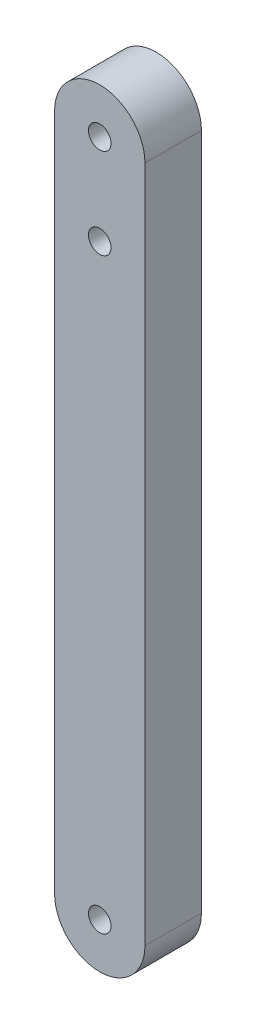
ISO-10303-21;
HEADER;
FILE_DESCRIPTION(('STEP AP214'),'2;1');
FILE_NAME('part.step','',(''),(''),'','','');
FILE_SCHEMA(('AUTOMOTIVE_DESIGN { 1 0 10303 214 1 1 1 1 }'));
ENDSEC;
DATA;
#1=APPLICATION_CONTEXT('core data for automotive mechanical design processes');
#2=APPLICATION_PROTOCOL_DEFINITION('international standard','automotive_design',2000,#1);
#3=PRODUCT_CONTEXT('',#1,'mechanical');
#4=PRODUCT('Part','Part','',(#3));
#5=PRODUCT_RELATED_PRODUCT_CATEGORY('part','',(#4));
#6=PRODUCT_DEFINITION_FORMATION('','',#4);
#7=PRODUCT_DEFINITION_CONTEXT('part definition',#1,'design');
#8=PRODUCT_DEFINITION('design','',#6,#7);
#9=PRODUCT_DEFINITION_SHAPE('','',#8);
#10=(LENGTH_UNIT() NAMED_UNIT(*) SI_UNIT(.MILLI.,.METRE.));
#11=(NAMED_UNIT(*) PLANE_ANGLE_UNIT() SI_UNIT($,.RADIAN.));
#12=(NAMED_UNIT(*) SI_UNIT($,.STERADIAN.) SOLID_ANGLE_UNIT());
#13=UNCERTAINTY_MEASURE_WITH_UNIT(LENGTH_MEASURE(1.E-05),#10,'distance_accuracy_value','');
#14=(GEOMETRIC_REPRESENTATION_CONTEXT(3) GLOBAL_UNCERTAINTY_ASSIGNED_CONTEXT((#13)) GLOBAL_UNIT_ASSIGNED_CONTEXT((#10,
#11,#12)) REPRESENTATION_CONTEXT('',''));
#15=CARTESIAN_POINT('',(0.,0.,0.));
#16=DIRECTION('',(0.,0.,1.));
#17=DIRECTION('',(1.,0.,0.));
#18=AXIS2_PLACEMENT_3D('',#15,#16,#17);
#19=CARTESIAN_POINT('',(0.,0.,10.));
#20=DIRECTION('',(0.,0.,1.));
#21=DIRECTION('',(1.,0.,0.));
#22=AXIS2_PLACEMENT_3D('',#19,#20,#21);
#23=PLANE('',#22);
#24=CARTESIAN_POINT('',(0.,0.,10.));
#25=DIRECTION('',(0.,0.,1.));
#26=DIRECTION('',(1.,0.,0.));
#27=AXIS2_PLACEMENT_3D('',#24,#25,#26);
#28=CIRCLE('',#27,2.);
#29=CARTESIAN_POINT('',(2.,0.,10.));
#30=VERTEX_POINT('',#29);
#31=EDGE_CURVE('E120',#30,#30,#28,.T.);
#32=ORIENTED_EDGE('',*,*,#31,.F.);
#33=EDGE_LOOP('',(#32));
#34=FACE_BOUND('',#33,.T.);
#35=CARTESIAN_POINT('',(0.,0.,10.));
#36=DIRECTION('',(0.,0.,1.));
#37=DIRECTION('',(1.,0.,0.));
#38=AXIS2_PLACEMENT_3D('',#35,#36,#37);
#39=CIRCLE('',#38,8.);
#40=CARTESIAN_POINT('',(-8.,0.,10.));
#41=VERTEX_POINT('',#40);
#42=CARTESIAN_POINT('',(8.,0.,10.));
#43=VERTEX_POINT('',#42);
#44=EDGE_CURVE('E90',#41,#43,#39,.T.);
#45=ORIENTED_EDGE('',*,*,#44,.T.);
#46=DIRECTION('',(0.,1.,0.));
#47=VECTOR('',#46,1.);
#48=CARTESIAN_POINT('',(8.,0.,10.));
#49=LINE('',#48,#47);
#50=CARTESIAN_POINT('',(8.,120.,10.));
#51=VERTEX_POINT('',#50);
#52=EDGE_CURVE('E85',#43,#51,#49,.T.);
#53=ORIENTED_EDGE('',*,*,#52,.T.);
#54=CARTESIAN_POINT('',(0.,120.,10.));
#55=DIRECTION('',(0.,0.,1.));
#56=DIRECTION('',(1.,0.,0.));
#57=AXIS2_PLACEMENT_3D('',#54,#55,#56);
#58=CIRCLE('',#57,8.);
#59=CARTESIAN_POINT('',(-8.,120.,10.));
#60=VERTEX_POINT('',#59);
#61=EDGE_CURVE('E88',#51,#60,#58,.T.);
#62=ORIENTED_EDGE('',*,*,#61,.T.);
#63=DIRECTION('',(0.,-1.,0.));
#64=VECTOR('',#63,1.);
#65=CARTESIAN_POINT('',(-8.,0.,10.));
#66=LINE('',#65,#64);
#67=EDGE_CURVE('E55',#60,#41,#66,.T.);
#68=ORIENTED_EDGE('',*,*,#67,.T.);
#69=EDGE_LOOP('',(#45,#53,#62,#68));
#70=FACE_BOUND('',#69,.T.);
#71=CARTESIAN_POINT('',(0.,120.,10.));
#72=DIRECTION('',(0.,0.,1.));
#73=DIRECTION('',(1.,0.,0.));
#74=AXIS2_PLACEMENT_3D('',#71,#72,#73);
#75=CIRCLE('',#74,2.);
#76=CARTESIAN_POINT('',(2.,120.,10.));
#77=VERTEX_POINT('',#76);
#78=EDGE_CURVE('E105',#77,#77,#75,.T.);
#79=ORIENTED_EDGE('',*,*,#78,.F.);
#80=EDGE_LOOP('',(#79));
#81=FACE_BOUND('',#80,.T.);
#82=CARTESIAN_POINT('',(0.,104.,10.));
#83=DIRECTION('',(0.,0.,1.));
#84=DIRECTION('',(1.,0.,0.));
#85=AXIS2_PLACEMENT_3D('',#82,#83,#84);
#86=CIRCLE('',#85,2.);
#87=CARTESIAN_POINT('',(2.,104.,10.));
#88=VERTEX_POINT('',#87);
#89=EDGE_CURVE('E126',#88,#88,#86,.T.);
#90=ORIENTED_EDGE('',*,*,#89,.F.);
#91=EDGE_LOOP('',(#90));
#92=FACE_BOUND('',#91,.T.);
#93=ADVANCED_FACE('F38',(#34,#70,#81,#92),#23,.T.);
#94=CARTESIAN_POINT('',(0.,0.,0.));
#95=DIRECTION('',(0.,0.,1.));
#96=DIRECTION('',(1.,0.,0.));
#97=AXIS2_PLACEMENT_3D('',#94,#95,#96);
#98=PLANE('',#97);
#99=CARTESIAN_POINT('',(0.,0.,0.));
#100=DIRECTION('',(0.,0.,1.));
#101=DIRECTION('',(1.,0.,0.));
#102=AXIS2_PLACEMENT_3D('',#99,#100,#101);
#103=CIRCLE('',#102,8.);
#104=CARTESIAN_POINT('',(-8.,0.,0.));
#105=VERTEX_POINT('',#104);
#106=CARTESIAN_POINT('',(8.,0.,0.));
#107=VERTEX_POINT('',#106);
#108=EDGE_CURVE('E102',#105,#107,#103,.T.);
#109=ORIENTED_EDGE('',*,*,#108,.F.);
#110=DIRECTION('',(0.,-1.,0.));
#111=VECTOR('',#110,1.);
#112=CARTESIAN_POINT('',(-8.,0.,0.));
#113=LINE('',#112,#111);
#114=CARTESIAN_POINT('',(-8.,120.,0.));
#115=VERTEX_POINT('',#114);
#116=EDGE_CURVE('E78',#115,#105,#113,.T.);
#117=ORIENTED_EDGE('',*,*,#116,.F.);
#118=CARTESIAN_POINT('',(0.,120.,0.));
#119=DIRECTION('',(0.,0.,1.));
#120=DIRECTION('',(1.,0.,0.));
#121=AXIS2_PLACEMENT_3D('',#118,#119,#120);
#122=CIRCLE('',#121,8.);
#123=CARTESIAN_POINT('',(8.,120.,0.));
#124=VERTEX_POINT('',#123);
#125=EDGE_CURVE('E72',#124,#115,#122,.T.);
#126=ORIENTED_EDGE('',*,*,#125,.F.);
#127=DIRECTION('',(0.,1.,0.));
#128=VECTOR('',#127,1.);
#129=CARTESIAN_POINT('',(8.,0.,0.));
#130=LINE('',#129,#128);
#131=EDGE_CURVE('E94',#107,#124,#130,.T.);
#132=ORIENTED_EDGE('',*,*,#131,.F.);
#133=EDGE_LOOP('',(#109,#117,#126,#132));
#134=FACE_BOUND('',#133,.T.);
#135=CARTESIAN_POINT('',(0.,120.,0.));
#136=DIRECTION('',(0.,0.,1.));
#137=DIRECTION('',(1.,0.,0.));
#138=AXIS2_PLACEMENT_3D('',#135,#136,#137);
#139=CIRCLE('',#138,2.);
#140=CARTESIAN_POINT('',(2.,120.,0.));
#141=VERTEX_POINT('',#140);
#142=EDGE_CURVE('E117',#141,#141,#139,.T.);
#143=ORIENTED_EDGE('',*,*,#142,.T.);
#144=EDGE_LOOP('',(#143));
#145=FACE_BOUND('',#144,.T.);
#146=CARTESIAN_POINT('',(0.,0.,0.));
#147=DIRECTION('',(0.,0.,1.));
#148=DIRECTION('',(1.,0.,0.));
#149=AXIS2_PLACEMENT_3D('',#146,#147,#148);
#150=CIRCLE('',#149,2.);
#151=CARTESIAN_POINT('',(2.,0.,0.));
#152=VERTEX_POINT('',#151);
#153=EDGE_CURVE('E123',#152,#152,#150,.T.);
#154=ORIENTED_EDGE('',*,*,#153,.T.);
#155=EDGE_LOOP('',(#154));
#156=FACE_BOUND('',#155,.T.);
#157=CARTESIAN_POINT('',(0.,104.,0.));
#158=DIRECTION('',(0.,0.,1.));
#159=DIRECTION('',(1.,0.,0.));
#160=AXIS2_PLACEMENT_3D('',#157,#158,#159);
#161=CIRCLE('',#160,2.);
#162=CARTESIAN_POINT('',(2.,104.,0.));
#163=VERTEX_POINT('',#162);
#164=EDGE_CURVE('E129',#163,#163,#161,.T.);
#165=ORIENTED_EDGE('',*,*,#164,.T.);
#166=EDGE_LOOP('',(#165));
#167=FACE_BOUND('',#166,.T.);
#168=ADVANCED_FACE('F113',(#134,#145,#156,#167),#98,.F.);
#169=CARTESIAN_POINT('',(0.,0.,10.));
#170=DIRECTION('',(0.,0.,-1.));
#171=DIRECTION('',(-1.,0.,0.));
#172=AXIS2_PLACEMENT_3D('',#169,#170,#171);
#173=CYLINDRICAL_SURFACE('',#172,8.);
#174=ORIENTED_EDGE('',*,*,#108,.T.);
#175=DIRECTION('',(0.,0.,-1.));
#176=VECTOR('',#175,1.);
#177=CARTESIAN_POINT('',(8.,0.,10.));
#178=LINE('',#177,#176);
#179=EDGE_CURVE('E11',#43,#107,#178,.T.);
#180=ORIENTED_EDGE('',*,*,#179,.F.);
#181=ORIENTED_EDGE('',*,*,#44,.F.);
#182=DIRECTION('',(0.,0.,-1.));
#183=VECTOR('',#182,1.);
#184=CARTESIAN_POINT('',(-8.,0.,10.));
#185=LINE('',#184,#183);
#186=EDGE_CURVE('E98',#41,#105,#185,.T.);
#187=ORIENTED_EDGE('',*,*,#186,.T.);
#188=EDGE_LOOP('',(#174,#180,#181,#187));
#189=FACE_BOUND('',#188,.T.);
#190=ADVANCED_FACE('F40',(#189),#173,.T.);
#191=CARTESIAN_POINT('',(8.,0.,10.));
#192=DIRECTION('',(-1.,0.,0.));
#193=DIRECTION('',(0.,0.,1.));
#194=AXIS2_PLACEMENT_3D('',#191,#192,#193);
#195=PLANE('',#194);
#196=ORIENTED_EDGE('',*,*,#131,.T.);
#197=DIRECTION('',(0.,0.,-1.));
#198=VECTOR('',#197,1.);
#199=CARTESIAN_POINT('',(8.,120.,10.));
#200=LINE('',#199,#198);
#201=EDGE_CURVE('E47',#51,#124,#200,.T.);
#202=ORIENTED_EDGE('',*,*,#201,.F.);
#203=ORIENTED_EDGE('',*,*,#52,.F.);
#204=ORIENTED_EDGE('',*,*,#179,.T.);
#205=EDGE_LOOP('',(#196,#202,#203,#204));
#206=FACE_BOUND('',#205,.T.);
#207=ADVANCED_FACE('F93',(#206),#195,.F.);
#208=CARTESIAN_POINT('',(0.,120.,10.));
#209=DIRECTION('',(0.,0.,-1.));
#210=DIRECTION('',(-1.,0.,0.));
#211=AXIS2_PLACEMENT_3D('',#208,#209,#210);
#212=CYLINDRICAL_SURFACE('',#211,8.);
#213=ORIENTED_EDGE('',*,*,#125,.T.);
#214=DIRECTION('',(0.,0.,-1.));
#215=VECTOR('',#214,1.);
#216=CARTESIAN_POINT('',(-8.,120.,10.));
#217=LINE('',#216,#215);
#218=EDGE_CURVE('E95',#60,#115,#217,.T.);
#219=ORIENTED_EDGE('',*,*,#218,.F.);
#220=ORIENTED_EDGE('',*,*,#61,.F.);
#221=ORIENTED_EDGE('',*,*,#201,.T.);
#222=EDGE_LOOP('',(#213,#219,#220,#221));
#223=FACE_BOUND('',#222,.T.);
#224=ADVANCED_FACE('F96',(#223),#212,.T.);
#225=CARTESIAN_POINT('',(-8.,0.,10.));
#226=DIRECTION('',(1.,0.,0.));
#227=DIRECTION('',(0.,0.,-1.));
#228=AXIS2_PLACEMENT_3D('',#225,#226,#227);
#229=PLANE('',#228);
#230=ORIENTED_EDGE('',*,*,#116,.T.);
#231=ORIENTED_EDGE('',*,*,#186,.F.);
#232=ORIENTED_EDGE('',*,*,#67,.F.);
#233=ORIENTED_EDGE('',*,*,#218,.T.);
#234=EDGE_LOOP('',(#230,#231,#232,#233));
#235=FACE_BOUND('',#234,.T.);
#236=ADVANCED_FACE('F110',(#235),#229,.F.);
#237=CARTESIAN_POINT('',(0.,120.,10.));
#238=DIRECTION('',(0.,0.,-1.));
#239=DIRECTION('',(-1.,0.,0.));
#240=AXIS2_PLACEMENT_3D('',#237,#238,#239);
#241=CYLINDRICAL_SURFACE('',#240,2.);
#242=ORIENTED_EDGE('',*,*,#78,.T.);
#243=EDGE_LOOP('',(#242));
#244=FACE_BOUND('',#243,.T.);
#245=ORIENTED_EDGE('',*,*,#142,.F.);
#246=EDGE_LOOP('',(#245));
#247=FACE_BOUND('',#246,.T.);
#248=ADVANCED_FACE('F147',(#244,#247),#241,.F.);
#249=CARTESIAN_POINT('',(0.,0.,10.));
#250=DIRECTION('',(0.,0.,-1.));
#251=DIRECTION('',(-1.,0.,0.));
#252=AXIS2_PLACEMENT_3D('',#249,#250,#251);
#253=CYLINDRICAL_SURFACE('',#252,2.);
#254=ORIENTED_EDGE('',*,*,#31,.T.);
#255=EDGE_LOOP('',(#254));
#256=FACE_BOUND('',#255,.T.);
#257=ORIENTED_EDGE('',*,*,#153,.F.);
#258=EDGE_LOOP('',(#257));
#259=FACE_BOUND('',#258,.T.);
#260=ADVANCED_FACE('F201',(#256,#259),#253,.F.);
#261=CARTESIAN_POINT('',(0.,104.,10.));
#262=DIRECTION('',(0.,0.,-1.));
#263=DIRECTION('',(-1.,0.,0.));
#264=AXIS2_PLACEMENT_3D('',#261,#262,#263);
#265=CYLINDRICAL_SURFACE('',#264,2.);
#266=ORIENTED_EDGE('',*,*,#89,.T.);
#267=EDGE_LOOP('',(#266));
#268=FACE_BOUND('',#267,.T.);
#269=ORIENTED_EDGE('',*,*,#164,.F.);
#270=EDGE_LOOP('',(#269));
#271=FACE_BOUND('',#270,.T.);
#272=ADVANCED_FACE('F135',(#268,#271),#265,.F.);
#273=CLOSED_SHELL('',(#93,#168,#190,#207,#224,#236,#248,#260,#272));
#274=MANIFOLD_SOLID_BREP('B2',#273);
#275=ADVANCED_BREP_SHAPE_REPRESENTATION('',(#18,#274),#14);
#276=SHAPE_DEFINITION_REPRESENTATION(#9,#275);
ENDSEC;
END-ISO-10303-21;
